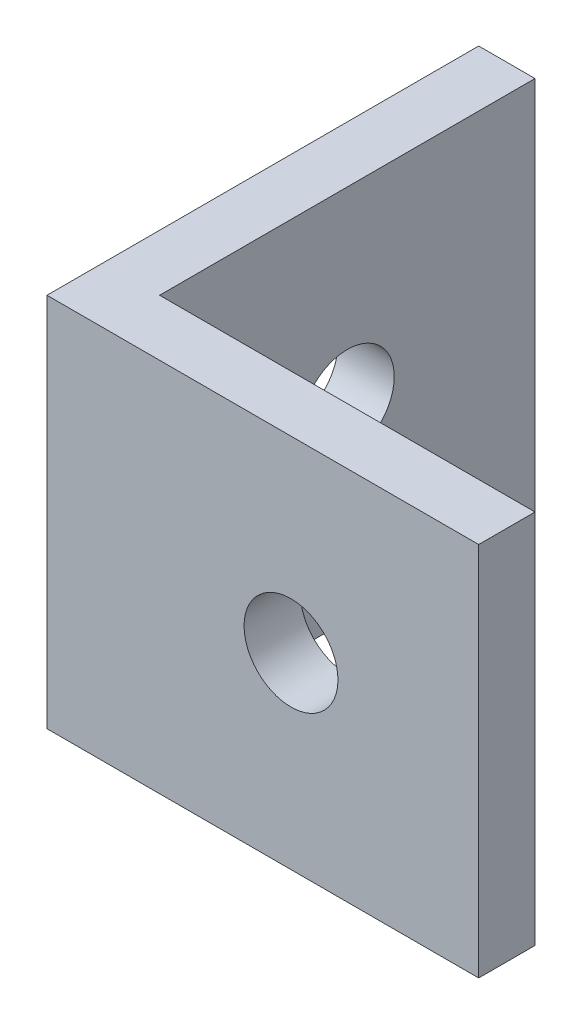
ISO-10303-21;
HEADER;
FILE_DESCRIPTION(('STEP AP214'),'2;1');
FILE_NAME('part.step','',(''),(''),'','','');
FILE_SCHEMA(('AUTOMOTIVE_DESIGN { 1 0 10303 214 1 1 1 1 }'));
ENDSEC;
DATA;
#1=APPLICATION_CONTEXT('core data for automotive mechanical design processes');
#2=APPLICATION_PROTOCOL_DEFINITION('international standard','automotive_design',2000,#1);
#3=PRODUCT_CONTEXT('',#1,'mechanical');
#4=PRODUCT('Part','Part','',(#3));
#5=PRODUCT_RELATED_PRODUCT_CATEGORY('part','',(#4));
#6=PRODUCT_DEFINITION_FORMATION('','',#4);
#7=PRODUCT_DEFINITION_CONTEXT('part definition',#1,'design');
#8=PRODUCT_DEFINITION('design','',#6,#7);
#9=PRODUCT_DEFINITION_SHAPE('','',#8);
#10=(LENGTH_UNIT() NAMED_UNIT(*) SI_UNIT(.MILLI.,.METRE.));
#11=(NAMED_UNIT(*) PLANE_ANGLE_UNIT() SI_UNIT($,.RADIAN.));
#12=(NAMED_UNIT(*) SI_UNIT($,.STERADIAN.) SOLID_ANGLE_UNIT());
#13=UNCERTAINTY_MEASURE_WITH_UNIT(LENGTH_MEASURE(1.E-05),#10,'distance_accuracy_value','');
#14=(GEOMETRIC_REPRESENTATION_CONTEXT(3) GLOBAL_UNCERTAINTY_ASSIGNED_CONTEXT((#13)) GLOBAL_UNIT_ASSIGNED_CONTEXT((#10,
#11,#12)) REPRESENTATION_CONTEXT('',''));
#15=CARTESIAN_POINT('',(0.,0.,0.));
#16=DIRECTION('',(0.,0.,1.));
#17=DIRECTION('',(1.,0.,0.));
#18=AXIS2_PLACEMENT_3D('',#15,#16,#17);
#19=CARTESIAN_POINT('',(3.,10.,-11.5));
#20=DIRECTION('',(0.,0.,1.));
#21=DIRECTION('',(0.,-1.,0.));
#22=AXIS2_PLACEMENT_3D('',#19,#20,#21);
#23=PLANE('',#22);
#24=DIRECTION('',(0.,1.,0.));
#25=VECTOR('',#24,1.);
#26=CARTESIAN_POINT('',(0.,10.,-11.5));
#27=LINE('',#26,#25);
#28=CARTESIAN_POINT('',(0.,-10.,-11.5));
#29=VERTEX_POINT('',#28);
#30=CARTESIAN_POINT('',(0.,10.,-11.5));
#31=VERTEX_POINT('',#30);
#32=EDGE_CURVE('E89',#29,#31,#27,.T.);
#33=ORIENTED_EDGE('',*,*,#32,.T.);
#34=DIRECTION('',(-1.,0.,0.));
#35=VECTOR('',#34,1.);
#36=CARTESIAN_POINT('',(3.,10.,-11.5));
#37=LINE('',#36,#35);
#38=CARTESIAN_POINT('',(3.,10.,-11.5));
#39=VERTEX_POINT('',#38);
#40=EDGE_CURVE('E11',#39,#31,#37,.T.);
#41=ORIENTED_EDGE('',*,*,#40,.F.);
#42=DIRECTION('',(0.,1.,0.));
#43=VECTOR('',#42,1.);
#44=CARTESIAN_POINT('',(3.,10.,-11.5));
#45=LINE('',#44,#43);
#46=CARTESIAN_POINT('',(3.,-10.,-11.5));
#47=VERTEX_POINT('',#46);
#48=EDGE_CURVE('E83',#47,#39,#45,.T.);
#49=ORIENTED_EDGE('',*,*,#48,.F.);
#50=DIRECTION('',(-1.,0.,0.));
#51=VECTOR('',#50,1.);
#52=CARTESIAN_POINT('',(3.,-10.,-11.5));
#53=LINE('',#52,#51);
#54=EDGE_CURVE('E75',#47,#29,#53,.T.);
#55=ORIENTED_EDGE('',*,*,#54,.T.);
#56=EDGE_LOOP('',(#33,#41,#49,#55));
#57=FACE_BOUND('',#56,.T.);
#58=ADVANCED_FACE('F33',(#57),#23,.F.);
#59=CARTESIAN_POINT('',(3.,10.,11.5));
#60=DIRECTION('',(0.,-1.,0.));
#61=DIRECTION('',(0.,0.,-1.));
#62=AXIS2_PLACEMENT_3D('',#59,#60,#61);
#63=PLANE('',#62);
#64=DIRECTION('',(0.,0.,1.));
#65=VECTOR('',#64,1.);
#66=CARTESIAN_POINT('',(0.,10.,11.5));
#67=LINE('',#66,#65);
#68=CARTESIAN_POINT('',(0.,10.,11.5));
#69=VERTEX_POINT('',#68);
#70=EDGE_CURVE('E92',#31,#69,#67,.T.);
#71=ORIENTED_EDGE('',*,*,#70,.T.);
#72=DIRECTION('',(-1.,0.,0.));
#73=VECTOR('',#72,1.);
#74=CARTESIAN_POINT('',(3.,10.,11.5));
#75=LINE('',#74,#73);
#76=CARTESIAN_POINT('',(23.,10.,11.5));
#77=VERTEX_POINT('',#76);
#78=EDGE_CURVE('E40',#77,#69,#75,.T.);
#79=ORIENTED_EDGE('',*,*,#78,.F.);
#80=DIRECTION('',(0.,0.,1.));
#81=VECTOR('',#80,1.);
#82=CARTESIAN_POINT('',(23.,10.,11.5));
#83=LINE('',#82,#81);
#84=CARTESIAN_POINT('',(23.,10.,8.5));
#85=VERTEX_POINT('',#84);
#86=EDGE_CURVE('E116',#85,#77,#83,.T.);
#87=ORIENTED_EDGE('',*,*,#86,.F.);
#88=DIRECTION('',(-1.,0.,0.));
#89=VECTOR('',#88,1.);
#90=CARTESIAN_POINT('',(23.,10.,8.5));
#91=LINE('',#90,#89);
#92=CARTESIAN_POINT('',(3.,10.,8.5));
#93=VERTEX_POINT('',#92);
#94=EDGE_CURVE('E97',#85,#93,#91,.T.);
#95=ORIENTED_EDGE('',*,*,#94,.T.);
#96=DIRECTION('',(0.,0.,1.));
#97=VECTOR('',#96,1.);
#98=CARTESIAN_POINT('',(3.,10.,11.5));
#99=LINE('',#98,#97);
#100=EDGE_CURVE('E134',#39,#93,#99,.T.);
#101=ORIENTED_EDGE('',*,*,#100,.F.);
#102=ORIENTED_EDGE('',*,*,#40,.T.);
#103=EDGE_LOOP('',(#71,#79,#87,#95,#101,#102));
#104=FACE_BOUND('',#103,.T.);
#105=ADVANCED_FACE('F113',(#104),#63,.F.);
#106=CARTESIAN_POINT('',(3.,10.,11.5));
#107=DIRECTION('',(0.,0.,-1.));
#108=DIRECTION('',(0.,1.,0.));
#109=AXIS2_PLACEMENT_3D('',#106,#107,#108);
#110=PLANE('',#109);
#111=CARTESIAN_POINT('',(13.,0.,11.5));
#112=DIRECTION('',(0.,0.,-1.));
#113=DIRECTION('',(0.,1.,0.));
#114=AXIS2_PLACEMENT_3D('',#111,#112,#113);
#115=CIRCLE('',#114,2.5);
#116=CARTESIAN_POINT('',(13.,2.5,11.5));
#117=VERTEX_POINT('',#116);
#118=EDGE_CURVE('E151',#117,#117,#115,.F.);
#119=ORIENTED_EDGE('',*,*,#118,.F.);
#120=EDGE_LOOP('',(#119));
#121=FACE_BOUND('',#120,.T.);
#122=DIRECTION('',(0.,-1.,0.));
#123=VECTOR('',#122,1.);
#124=CARTESIAN_POINT('',(0.,10.,11.5));
#125=LINE('',#124,#123);
#126=CARTESIAN_POINT('',(0.,-10.,11.5));
#127=VERTEX_POINT('',#126);
#128=EDGE_CURVE('E84',#69,#127,#125,.T.);
#129=ORIENTED_EDGE('',*,*,#128,.T.);
#130=DIRECTION('',(-1.,0.,0.));
#131=VECTOR('',#130,1.);
#132=CARTESIAN_POINT('',(3.,-10.,11.5));
#133=LINE('',#132,#131);
#134=CARTESIAN_POINT('',(23.,-10.,11.5));
#135=VERTEX_POINT('',#134);
#136=EDGE_CURVE('E79',#135,#127,#133,.T.);
#137=ORIENTED_EDGE('',*,*,#136,.F.);
#138=DIRECTION('',(0.,-1.,0.));
#139=VECTOR('',#138,1.);
#140=CARTESIAN_POINT('',(23.,10.,11.5));
#141=LINE('',#140,#139);
#142=EDGE_CURVE('E109',#77,#135,#141,.T.);
#143=ORIENTED_EDGE('',*,*,#142,.F.);
#144=ORIENTED_EDGE('',*,*,#78,.T.);
#145=EDGE_LOOP('',(#129,#137,#143,#144));
#146=FACE_BOUND('',#145,.T.);
#147=ADVANCED_FACE('F107',(#121,#146),#110,.F.);
#148=CARTESIAN_POINT('',(3.,-10.,11.5));
#149=DIRECTION('',(0.,1.,0.));
#150=DIRECTION('',(0.,0.,1.));
#151=AXIS2_PLACEMENT_3D('',#148,#149,#150);
#152=PLANE('',#151);
#153=DIRECTION('',(0.,0.,-1.));
#154=VECTOR('',#153,1.);
#155=CARTESIAN_POINT('',(0.,-10.,11.5));
#156=LINE('',#155,#154);
#157=EDGE_CURVE('E72',#127,#29,#156,.T.);
#158=ORIENTED_EDGE('',*,*,#157,.T.);
#159=ORIENTED_EDGE('',*,*,#54,.F.);
#160=DIRECTION('',(0.,0.,-1.));
#161=VECTOR('',#160,1.);
#162=CARTESIAN_POINT('',(3.,-10.,11.5));
#163=LINE('',#162,#161);
#164=CARTESIAN_POINT('',(3.,-10.,8.5));
#165=VERTEX_POINT('',#164);
#166=EDGE_CURVE('E52',#165,#47,#163,.T.);
#167=ORIENTED_EDGE('',*,*,#166,.F.);
#168=DIRECTION('',(-1.,0.,0.));
#169=VECTOR('',#168,1.);
#170=CARTESIAN_POINT('',(23.,-10.,8.5));
#171=LINE('',#170,#169);
#172=CARTESIAN_POINT('',(23.,-10.,8.5));
#173=VERTEX_POINT('',#172);
#174=EDGE_CURVE('E93',#173,#165,#171,.T.);
#175=ORIENTED_EDGE('',*,*,#174,.F.);
#176=DIRECTION('',(0.,0.,-1.));
#177=VECTOR('',#176,1.);
#178=CARTESIAN_POINT('',(23.,-10.,11.5));
#179=LINE('',#178,#177);
#180=EDGE_CURVE('E128',#135,#173,#179,.T.);
#181=ORIENTED_EDGE('',*,*,#180,.F.);
#182=ORIENTED_EDGE('',*,*,#136,.T.);
#183=EDGE_LOOP('',(#158,#159,#167,#175,#181,#182));
#184=FACE_BOUND('',#183,.T.);
#185=ADVANCED_FACE('F74',(#184),#152,.F.);
#186=CARTESIAN_POINT('',(3.,0.,0.));
#187=DIRECTION('',(1.,0.,0.));
#188=DIRECTION('',(0.,0.,-1.));
#189=AXIS2_PLACEMENT_3D('',#186,#187,#188);
#190=PLANE('',#189);
#191=CARTESIAN_POINT('',(3.,0.,-1.5));
#192=DIRECTION('',(1.,0.,0.));
#193=DIRECTION('',(0.,0.,-1.));
#194=AXIS2_PLACEMENT_3D('',#191,#192,#193);
#195=CIRCLE('',#194,2.5);
#196=CARTESIAN_POINT('',(3.,0.,-4.));
#197=VERTEX_POINT('',#196);
#198=EDGE_CURVE('E148',#197,#197,#195,.T.);
#199=ORIENTED_EDGE('',*,*,#198,.F.);
#200=EDGE_LOOP('',(#199));
#201=FACE_BOUND('',#200,.T.);
#202=DIRECTION('',(0.,1.,0.));
#203=VECTOR('',#202,1.);
#204=CARTESIAN_POINT('',(3.,10.,8.5));
#205=LINE('',#204,#203);
#206=EDGE_CURVE('E47',#165,#93,#205,.T.);
#207=ORIENTED_EDGE('',*,*,#206,.F.);
#208=ORIENTED_EDGE('',*,*,#166,.T.);
#209=ORIENTED_EDGE('',*,*,#48,.T.);
#210=ORIENTED_EDGE('',*,*,#100,.T.);
#211=EDGE_LOOP('',(#207,#208,#209,#210));
#212=FACE_BOUND('',#211,.T.);
#213=ADVANCED_FACE('F136',(#201,#212),#190,.T.);
#214=CARTESIAN_POINT('',(0.,0.,0.));
#215=DIRECTION('',(1.,0.,0.));
#216=DIRECTION('',(0.,0.,-1.));
#217=AXIS2_PLACEMENT_3D('',#214,#215,#216);
#218=PLANE('',#217);
#219=CARTESIAN_POINT('',(0.,0.,-1.5));
#220=DIRECTION('',(1.,0.,0.));
#221=DIRECTION('',(0.,0.,-1.));
#222=AXIS2_PLACEMENT_3D('',#219,#220,#221);
#223=CIRCLE('',#222,2.5);
#224=CARTESIAN_POINT('',(0.,0.,-4.));
#225=VERTEX_POINT('',#224);
#226=EDGE_CURVE('E132',#225,#225,#223,.F.);
#227=ORIENTED_EDGE('',*,*,#226,.F.);
#228=EDGE_LOOP('',(#227));
#229=FACE_BOUND('',#228,.T.);
#230=ORIENTED_EDGE('',*,*,#32,.F.);
#231=ORIENTED_EDGE('',*,*,#157,.F.);
#232=ORIENTED_EDGE('',*,*,#128,.F.);
#233=ORIENTED_EDGE('',*,*,#70,.F.);
#234=EDGE_LOOP('',(#230,#231,#232,#233));
#235=FACE_BOUND('',#234,.T.);
#236=ADVANCED_FACE('F91',(#229,#235),#218,.F.);
#237=CARTESIAN_POINT('',(23.,10.,8.5));
#238=DIRECTION('',(0.,0.,1.));
#239=DIRECTION('',(0.,-1.,0.));
#240=AXIS2_PLACEMENT_3D('',#237,#238,#239);
#241=PLANE('',#240);
#242=CARTESIAN_POINT('',(13.,0.,8.5));
#243=DIRECTION('',(0.,0.,-1.));
#244=DIRECTION('',(0.,1.,0.));
#245=AXIS2_PLACEMENT_3D('',#242,#243,#244);
#246=CIRCLE('',#245,2.5);
#247=CARTESIAN_POINT('',(13.,2.5,8.5));
#248=VERTEX_POINT('',#247);
#249=EDGE_CURVE('E154',#248,#248,#246,.T.);
#250=ORIENTED_EDGE('',*,*,#249,.F.);
#251=EDGE_LOOP('',(#250));
#252=FACE_BOUND('',#251,.T.);
#253=ORIENTED_EDGE('',*,*,#206,.T.);
#254=ORIENTED_EDGE('',*,*,#94,.F.);
#255=DIRECTION('',(0.,1.,0.));
#256=VECTOR('',#255,1.);
#257=CARTESIAN_POINT('',(23.,10.,8.5));
#258=LINE('',#257,#256);
#259=EDGE_CURVE('E124',#173,#85,#258,.T.);
#260=ORIENTED_EDGE('',*,*,#259,.F.);
#261=ORIENTED_EDGE('',*,*,#174,.T.);
#262=EDGE_LOOP('',(#253,#254,#260,#261));
#263=FACE_BOUND('',#262,.T.);
#264=ADVANCED_FACE('F138',(#252,#263),#241,.F.);
#265=CARTESIAN_POINT('',(23.,0.,0.));
#266=DIRECTION('',(1.,0.,0.));
#267=DIRECTION('',(0.,0.,-1.));
#268=AXIS2_PLACEMENT_3D('',#265,#266,#267);
#269=PLANE('',#268);
#270=ORIENTED_EDGE('',*,*,#142,.T.);
#271=ORIENTED_EDGE('',*,*,#180,.T.);
#272=ORIENTED_EDGE('',*,*,#259,.T.);
#273=ORIENTED_EDGE('',*,*,#86,.T.);
#274=EDGE_LOOP('',(#270,#271,#272,#273));
#275=FACE_BOUND('',#274,.T.);
#276=ADVANCED_FACE('F120',(#275),#269,.T.);
#277=CARTESIAN_POINT('',(-0.00100000000000013,0.,-1.5));
#278=DIRECTION('',(1.,0.,0.));
#279=DIRECTION('',(0.,0.,-1.));
#280=AXIS2_PLACEMENT_3D('',#277,#278,#279);
#281=CYLINDRICAL_SURFACE('',#280,2.5);
#282=CARTESIAN_POINT('',(3.,0.,-4.));
#283=CARTESIAN_POINT('',(2.96875,0.,-4.));
#284=CARTESIAN_POINT('',(2.9375,0.,-4.));
#285=CARTESIAN_POINT('',(2.875,0.,-4.));
#286=CARTESIAN_POINT('',(2.84375,0.,-4.));
#287=CARTESIAN_POINT('',(2.78125,0.,-4.));
#288=CARTESIAN_POINT('',(2.75,0.,-4.));
#289=CARTESIAN_POINT('',(2.6875,0.,-4.));
#290=CARTESIAN_POINT('',(2.65625,0.,-4.));
#291=CARTESIAN_POINT('',(2.59375,0.,-4.));
#292=CARTESIAN_POINT('',(2.5625,0.,-4.));
#293=CARTESIAN_POINT('',(2.5,0.,-4.));
#294=CARTESIAN_POINT('',(2.46875,0.,-4.));
#295=CARTESIAN_POINT('',(2.40625,0.,-4.));
#296=CARTESIAN_POINT('',(2.375,0.,-4.));
#297=CARTESIAN_POINT('',(2.3125,0.,-4.));
#298=CARTESIAN_POINT('',(2.28125,0.,-4.));
#299=CARTESIAN_POINT('',(2.21875,0.,-4.));
#300=CARTESIAN_POINT('',(2.1875,0.,-4.));
#301=CARTESIAN_POINT('',(2.125,0.,-4.));
#302=CARTESIAN_POINT('',(2.09375,0.,-4.));
#303=CARTESIAN_POINT('',(2.03125,0.,-4.));
#304=CARTESIAN_POINT('',(2.,0.,-4.));
#305=CARTESIAN_POINT('',(1.9375,0.,-4.));
#306=CARTESIAN_POINT('',(1.90625,0.,-4.));
#307=CARTESIAN_POINT('',(1.84375,0.,-4.));
#308=CARTESIAN_POINT('',(1.8125,0.,-4.));
#309=CARTESIAN_POINT('',(1.75,0.,-4.));
#310=CARTESIAN_POINT('',(1.71875,0.,-4.));
#311=CARTESIAN_POINT('',(1.65625,0.,-4.));
#312=CARTESIAN_POINT('',(1.625,0.,-4.));
#313=CARTESIAN_POINT('',(1.5625,0.,-4.));
#314=CARTESIAN_POINT('',(1.53125,0.,-4.));
#315=CARTESIAN_POINT('',(1.46875,0.,-4.));
#316=CARTESIAN_POINT('',(1.4375,0.,-4.));
#317=CARTESIAN_POINT('',(1.375,0.,-4.));
#318=CARTESIAN_POINT('',(1.34375,0.,-4.));
#319=CARTESIAN_POINT('',(1.28125,0.,-4.));
#320=CARTESIAN_POINT('',(1.25,0.,-4.));
#321=CARTESIAN_POINT('',(1.1875,0.,-4.));
#322=CARTESIAN_POINT('',(1.15625,0.,-4.));
#323=CARTESIAN_POINT('',(1.09375,0.,-4.));
#324=CARTESIAN_POINT('',(1.0625,0.,-4.));
#325=CARTESIAN_POINT('',(1.,0.,-4.));
#326=CARTESIAN_POINT('',(0.96875,0.,-4.));
#327=CARTESIAN_POINT('',(0.90625,0.,-4.));
#328=CARTESIAN_POINT('',(0.875,0.,-4.));
#329=CARTESIAN_POINT('',(0.8125,0.,-4.));
#330=CARTESIAN_POINT('',(0.78125,0.,-4.));
#331=CARTESIAN_POINT('',(0.71875,0.,-4.));
#332=CARTESIAN_POINT('',(0.6875,0.,-4.));
#333=CARTESIAN_POINT('',(0.625,0.,-4.));
#334=CARTESIAN_POINT('',(0.59375,0.,-4.));
#335=CARTESIAN_POINT('',(0.53125,0.,-4.));
#336=CARTESIAN_POINT('',(0.5,0.,-4.));
#337=CARTESIAN_POINT('',(0.4375,0.,-4.));
#338=CARTESIAN_POINT('',(0.40625,0.,-4.));
#339=CARTESIAN_POINT('',(0.34375,0.,-4.));
#340=CARTESIAN_POINT('',(0.3125,0.,-4.));
#341=CARTESIAN_POINT('',(0.25,0.,-4.));
#342=CARTESIAN_POINT('',(0.21875,0.,-4.));
#343=CARTESIAN_POINT('',(0.15625,0.,-4.));
#344=CARTESIAN_POINT('',(0.125,0.,-4.));
#345=CARTESIAN_POINT('',(0.0625000000000001,0.,-4.));
#346=CARTESIAN_POINT('',(0.0312500000000001,0.,-4.));
#347=CARTESIAN_POINT('',(0.,0.,-4.));
#348=B_SPLINE_CURVE_WITH_KNOTS('',3,(#282,#283,#284,#285,#286,#287,#288,#289,#290,#291,#292,
#293,#294,#295,#296,#297,#298,#299,#300,#301,#302,#303,#304,#305,#306,#307,#308,#309,#310,#311,
#312,#313,#314,#315,#316,#317,#318,#319,#320,#321,#322,#323,#324,#325,#326,#327,#328,#329,#330,
#331,#332,#333,#334,#335,#336,#337,#338,#339,#340,#341,#342,#343,#344,#345,#346,#347),
.UNSPECIFIED.,.F.,.F.,(4,2,2,2,2,2,2,2,2,2,2,2,2,2,2,2,2,2,2,2,2,2,2,2,2,2,2,2,2,2,2,2,4),(0.,
0.0937500000000001,0.1875,0.28125,0.375,0.46875,0.5625,0.65625,0.75,0.84375,0.9375,1.03125,
1.125,1.21875,1.3125,1.40625,1.5,1.59375,1.6875,1.78125,1.875,1.96875,2.0625,2.15625,2.25,
2.34375,2.4375,2.53125,2.625,2.71875,2.8125,2.90625,3.),.UNSPECIFIED.);
#349=EDGE_CURVE('BSEAM167',#197,#225,#348,.T.);
#350=ORIENTED_EDGE('',*,*,#198,.T.);
#351=ORIENTED_EDGE('',*,*,#226,.T.);
#352=ORIENTED_EDGE('',*,*,#349,.T.);
#353=ORIENTED_EDGE('',*,*,#349,.F.);
#354=EDGE_LOOP('',(#350,#352,#351,#353));
#355=FACE_BOUND('',#354,.T.);
#356=ADVANCED_FACE('F167',(#355),#281,.F.);
#357=CARTESIAN_POINT('',(13.,0.,11.501));
#358=DIRECTION('',(0.,0.,-1.));
#359=DIRECTION('',(0.,1.,0.));
#360=AXIS2_PLACEMENT_3D('',#357,#358,#359);
#361=CYLINDRICAL_SURFACE('',#360,2.5);
#362=ORIENTED_EDGE('',*,*,#249,.T.);
#363=EDGE_LOOP('',(#362));
#364=FACE_BOUND('',#363,.T.);
#365=ORIENTED_EDGE('',*,*,#118,.T.);
#366=EDGE_LOOP('',(#365));
#367=FACE_BOUND('',#366,.T.);
#368=ADVANCED_FACE('F158',(#364,#367),#361,.F.);
#369=CLOSED_SHELL('',(#58,#105,#147,#185,#213,#236,#264,#276,#356,#368));
#370=MANIFOLD_SOLID_BREP('B2',#369);
#371=ADVANCED_BREP_SHAPE_REPRESENTATION('',(#18,#370),#14);
#372=SHAPE_DEFINITION_REPRESENTATION(#9,#371);
ENDSEC;
END-ISO-10303-21;
